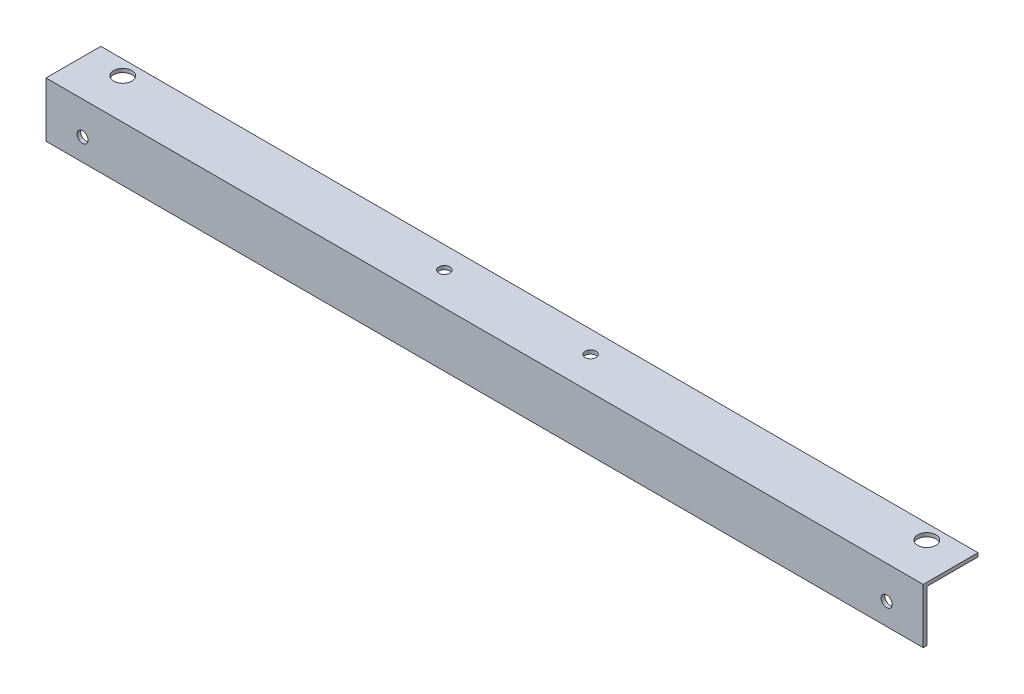
ISO-10303-21;
HEADER;
FILE_DESCRIPTION(('STEP AP214'),'2;1');
FILE_NAME('part.step','',(''),(''),'','','');
FILE_SCHEMA(('AUTOMOTIVE_DESIGN { 1 0 10303 214 1 1 1 1 }'));
ENDSEC;
DATA;
#1=APPLICATION_CONTEXT('core data for automotive mechanical design processes');
#2=APPLICATION_PROTOCOL_DEFINITION('international standard','automotive_design',2000,#1);
#3=PRODUCT_CONTEXT('',#1,'mechanical');
#4=PRODUCT('Part','Part','',(#3));
#5=PRODUCT_RELATED_PRODUCT_CATEGORY('part','',(#4));
#6=PRODUCT_DEFINITION_FORMATION('','',#4);
#7=PRODUCT_DEFINITION_CONTEXT('part definition',#1,'design');
#8=PRODUCT_DEFINITION('design','',#6,#7);
#9=PRODUCT_DEFINITION_SHAPE('','',#8);
#10=(LENGTH_UNIT() NAMED_UNIT(*) SI_UNIT(.MILLI.,.METRE.));
#11=(NAMED_UNIT(*) PLANE_ANGLE_UNIT() SI_UNIT($,.RADIAN.));
#12=(NAMED_UNIT(*) SI_UNIT($,.STERADIAN.) SOLID_ANGLE_UNIT());
#13=UNCERTAINTY_MEASURE_WITH_UNIT(LENGTH_MEASURE(1.E-05),#10,'distance_accuracy_value','');
#14=(GEOMETRIC_REPRESENTATION_CONTEXT(3) GLOBAL_UNCERTAINTY_ASSIGNED_CONTEXT((#13)) GLOBAL_UNIT_ASSIGNED_CONTEXT((#10,
#11,#12)) REPRESENTATION_CONTEXT('',''));
#15=CARTESIAN_POINT('',(0.,0.,0.));
#16=DIRECTION('',(0.,0.,1.));
#17=DIRECTION('',(1.,0.,0.));
#18=AXIS2_PLACEMENT_3D('',#15,#16,#17);
#19=CARTESIAN_POINT('',(120.,-1.,0.));
#20=DIRECTION('',(0.,1.,0.));
#21=DIRECTION('',(0.,0.,1.));
#22=AXIS2_PLACEMENT_3D('',#19,#20,#21);
#23=PLANE('',#22);
#24=CARTESIAN_POINT('',(-110.,-1.,-11.));
#25=DIRECTION('',(0.,1.,0.));
#26=DIRECTION('',(0.,0.,1.));
#27=AXIS2_PLACEMENT_3D('',#24,#25,#26);
#28=CIRCLE('',#27,2.50000000000001);
#29=CARTESIAN_POINT('',(-110.,-1.,-8.49999999999999));
#30=VERTEX_POINT('',#29);
#31=EDGE_CURVE('E144',#30,#30,#28,.T.);
#32=ORIENTED_EDGE('',*,*,#31,.T.);
#33=EDGE_LOOP('',(#32));
#34=FACE_BOUND('',#33,.T.);
#35=CARTESIAN_POINT('',(20.,-1.,-9.));
#36=DIRECTION('',(0.,1.,0.));
#37=DIRECTION('',(0.,0.,1.));
#38=AXIS2_PLACEMENT_3D('',#35,#36,#37);
#39=CIRCLE('',#38,1.5);
#40=CARTESIAN_POINT('',(20.,-1.,-7.5));
#41=VERTEX_POINT('',#40);
#42=EDGE_CURVE('E184',#41,#41,#39,.T.);
#43=ORIENTED_EDGE('',*,*,#42,.T.);
#44=EDGE_LOOP('',(#43));
#45=FACE_BOUND('',#44,.T.);
#46=CARTESIAN_POINT('',(110.,-1.,-11.));
#47=DIRECTION('',(0.,1.,0.));
#48=DIRECTION('',(0.,0.,1.));
#49=AXIS2_PLACEMENT_3D('',#46,#47,#48);
#50=CIRCLE('',#49,2.50000000000001);
#51=CARTESIAN_POINT('',(110.,-1.,-8.49999999999999));
#52=VERTEX_POINT('',#51);
#53=EDGE_CURVE('E188',#52,#52,#50,.T.);
#54=ORIENTED_EDGE('',*,*,#53,.T.);
#55=EDGE_LOOP('',(#54));
#56=FACE_BOUND('',#55,.T.);
#57=CARTESIAN_POINT('',(-20.,-1.,-9.));
#58=DIRECTION('',(0.,1.,0.));
#59=DIRECTION('',(0.,0.,1.));
#60=AXIS2_PLACEMENT_3D('',#57,#58,#59);
#61=CIRCLE('',#60,1.5);
#62=CARTESIAN_POINT('',(-20.,-1.,-7.5));
#63=VERTEX_POINT('',#62);
#64=EDGE_CURVE('E191',#63,#63,#61,.T.);
#65=ORIENTED_EDGE('',*,*,#64,.T.);
#66=EDGE_LOOP('',(#65));
#67=FACE_BOUND('',#66,.T.);
#68=DIRECTION('',(0.,0.,-1.));
#69=VECTOR('',#68,1.);
#70=CARTESIAN_POINT('',(-120.,-1.,0.));
#71=LINE('',#70,#69);
#72=CARTESIAN_POINT('',(-120.,-1.,-1.));
#73=VERTEX_POINT('',#72);
#74=CARTESIAN_POINT('',(-120.,-1.,-15.));
#75=VERTEX_POINT('',#74);
#76=EDGE_CURVE('E116',#73,#75,#71,.T.);
#77=ORIENTED_EDGE('',*,*,#76,.T.);
#78=DIRECTION('',(-1.,0.,0.));
#79=VECTOR('',#78,1.);
#80=CARTESIAN_POINT('',(120.,-1.,-15.));
#81=LINE('',#80,#79);
#82=CARTESIAN_POINT('',(120.,-1.,-15.));
#83=VERTEX_POINT('',#82);
#84=EDGE_CURVE('E11',#83,#75,#81,.T.);
#85=ORIENTED_EDGE('',*,*,#84,.F.);
#86=DIRECTION('',(0.,0.,-1.));
#87=VECTOR('',#86,1.);
#88=CARTESIAN_POINT('',(120.,-1.,0.));
#89=LINE('',#88,#87);
#90=CARTESIAN_POINT('',(120.,-1.,-1.));
#91=VERTEX_POINT('',#90);
#92=EDGE_CURVE('E81',#91,#83,#89,.T.);
#93=ORIENTED_EDGE('',*,*,#92,.F.);
#94=DIRECTION('',(-1.,0.,0.));
#95=VECTOR('',#94,1.);
#96=CARTESIAN_POINT('',(120.,-1.,-1.));
#97=LINE('',#96,#95);
#98=EDGE_CURVE('E112',#91,#73,#97,.T.);
#99=ORIENTED_EDGE('',*,*,#98,.T.);
#100=EDGE_LOOP('',(#77,#85,#93,#99));
#101=FACE_BOUND('',#100,.T.);
#102=ADVANCED_FACE('F33',(#34,#45,#56,#67,#101),#23,.F.);
#103=CARTESIAN_POINT('',(120.,0.,-15.));
#104=DIRECTION('',(0.,0.,-1.));
#105=DIRECTION('',(-1.,0.,0.));
#106=AXIS2_PLACEMENT_3D('',#103,#104,#105);
#107=PLANE('',#106);
#108=DIRECTION('',(0.,-1.,0.));
#109=VECTOR('',#108,1.);
#110=CARTESIAN_POINT('',(-120.,0.,-15.));
#111=LINE('',#110,#109);
#112=CARTESIAN_POINT('',(-120.,0.,-15.));
#113=VERTEX_POINT('',#112);
#114=EDGE_CURVE('E119',#113,#75,#111,.T.);
#115=ORIENTED_EDGE('',*,*,#114,.F.);
#116=DIRECTION('',(-1.,0.,0.));
#117=VECTOR('',#116,1.);
#118=CARTESIAN_POINT('',(120.,0.,-15.));
#119=LINE('',#118,#117);
#120=CARTESIAN_POINT('',(120.,0.,-15.));
#121=VERTEX_POINT('',#120);
#122=EDGE_CURVE('E42',#121,#113,#119,.T.);
#123=ORIENTED_EDGE('',*,*,#122,.F.);
#124=DIRECTION('',(0.,-1.,0.));
#125=VECTOR('',#124,1.);
#126=CARTESIAN_POINT('',(120.,0.,-15.));
#127=LINE('',#126,#125);
#128=EDGE_CURVE('E150',#121,#83,#127,.T.);
#129=ORIENTED_EDGE('',*,*,#128,.T.);
#130=ORIENTED_EDGE('',*,*,#84,.T.);
#131=EDGE_LOOP('',(#115,#123,#129,#130));
#132=FACE_BOUND('',#131,.T.);
#133=ADVANCED_FACE('F172',(#132),#107,.T.);
#134=CARTESIAN_POINT('',(120.,0.,0.));
#135=DIRECTION('',(0.,1.,0.));
#136=DIRECTION('',(0.,0.,1.));
#137=AXIS2_PLACEMENT_3D('',#134,#135,#136);
#138=PLANE('',#137);
#139=CARTESIAN_POINT('',(-110.,0.,-11.));
#140=DIRECTION('',(0.,1.,0.));
#141=DIRECTION('',(0.,0.,1.));
#142=AXIS2_PLACEMENT_3D('',#139,#140,#141);
#143=CIRCLE('',#142,2.50000000000001);
#144=CARTESIAN_POINT('',(-110.,0.,-8.49999999999999));
#145=VERTEX_POINT('',#144);
#146=EDGE_CURVE('E193',#145,#145,#143,.T.);
#147=ORIENTED_EDGE('',*,*,#146,.F.);
#148=EDGE_LOOP('',(#147));
#149=FACE_BOUND('',#148,.T.);
#150=CARTESIAN_POINT('',(20.,0.,-9.));
#151=DIRECTION('',(0.,1.,0.));
#152=DIRECTION('',(0.,0.,-1.));
#153=AXIS2_PLACEMENT_3D('',#150,#151,#152);
#154=CIRCLE('',#153,1.5);
#155=CARTESIAN_POINT('',(20.,0.,-10.5));
#156=VERTEX_POINT('',#155);
#157=EDGE_CURVE('E203',#156,#156,#154,.T.);
#158=ORIENTED_EDGE('',*,*,#157,.F.);
#159=EDGE_LOOP('',(#158));
#160=FACE_BOUND('',#159,.T.);
#161=CARTESIAN_POINT('',(110.,0.,-11.));
#162=DIRECTION('',(0.,1.,0.));
#163=DIRECTION('',(0.,0.,-1.));
#164=AXIS2_PLACEMENT_3D('',#161,#162,#163);
#165=CIRCLE('',#164,2.50000000000001);
#166=CARTESIAN_POINT('',(110.,0.,-13.5));
#167=VERTEX_POINT('',#166);
#168=EDGE_CURVE('E200',#167,#167,#165,.T.);
#169=ORIENTED_EDGE('',*,*,#168,.F.);
#170=EDGE_LOOP('',(#169));
#171=FACE_BOUND('',#170,.T.);
#172=CARTESIAN_POINT('',(-20.,0.,-9.));
#173=DIRECTION('',(0.,1.,0.));
#174=DIRECTION('',(0.,0.,1.));
#175=AXIS2_PLACEMENT_3D('',#172,#173,#174);
#176=CIRCLE('',#175,1.5);
#177=CARTESIAN_POINT('',(-20.,0.,-7.5));
#178=VERTEX_POINT('',#177);
#179=EDGE_CURVE('E197',#178,#178,#176,.T.);
#180=ORIENTED_EDGE('',*,*,#179,.F.);
#181=EDGE_LOOP('',(#180));
#182=FACE_BOUND('',#181,.T.);
#183=DIRECTION('',(0.,0.,-1.));
#184=VECTOR('',#183,1.);
#185=CARTESIAN_POINT('',(-120.,0.,0.));
#186=LINE('',#185,#184);
#187=CARTESIAN_POINT('',(-120.,0.,0.));
#188=VERTEX_POINT('',#187);
#189=EDGE_CURVE('E122',#188,#113,#186,.T.);
#190=ORIENTED_EDGE('',*,*,#189,.F.);
#191=DIRECTION('',(-1.,0.,0.));
#192=VECTOR('',#191,1.);
#193=CARTESIAN_POINT('',(120.,0.,0.));
#194=LINE('',#193,#192);
#195=CARTESIAN_POINT('',(120.,0.,0.));
#196=VERTEX_POINT('',#195);
#197=EDGE_CURVE('E102',#196,#188,#194,.T.);
#198=ORIENTED_EDGE('',*,*,#197,.F.);
#199=DIRECTION('',(0.,0.,-1.));
#200=VECTOR('',#199,1.);
#201=CARTESIAN_POINT('',(120.,0.,0.));
#202=LINE('',#201,#200);
#203=EDGE_CURVE('E108',#196,#121,#202,.T.);
#204=ORIENTED_EDGE('',*,*,#203,.T.);
#205=ORIENTED_EDGE('',*,*,#122,.T.);
#206=EDGE_LOOP('',(#190,#198,#204,#205));
#207=FACE_BOUND('',#206,.T.);
#208=ADVANCED_FACE('F154',(#149,#160,#171,#182,#207),#138,.T.);
#209=CARTESIAN_POINT('',(120.,-15.,0.));
#210=DIRECTION('',(0.,0.,1.));
#211=DIRECTION('',(1.,0.,0.));
#212=AXIS2_PLACEMENT_3D('',#209,#210,#211);
#213=PLANE('',#212);
#214=CARTESIAN_POINT('',(-110.,-9.,0.));
#215=DIRECTION('',(0.,0.,1.));
#216=DIRECTION('',(1.,0.,0.));
#217=AXIS2_PLACEMENT_3D('',#214,#215,#216);
#218=CIRCLE('',#217,1.5);
#219=CARTESIAN_POINT('',(-108.5,-9.,0.));
#220=VERTEX_POINT('',#219);
#221=EDGE_CURVE('E134',#220,#220,#218,.T.);
#222=ORIENTED_EDGE('',*,*,#221,.F.);
#223=EDGE_LOOP('',(#222));
#224=FACE_BOUND('',#223,.T.);
#225=CARTESIAN_POINT('',(110.,-9.,0.));
#226=DIRECTION('',(0.,0.,1.));
#227=DIRECTION('',(-1.,0.,0.));
#228=AXIS2_PLACEMENT_3D('',#225,#226,#227);
#229=CIRCLE('',#228,1.5);
#230=CARTESIAN_POINT('',(108.5,-9.,0.));
#231=VERTEX_POINT('',#230);
#232=EDGE_CURVE('E139',#231,#231,#229,.T.);
#233=ORIENTED_EDGE('',*,*,#232,.F.);
#234=EDGE_LOOP('',(#233));
#235=FACE_BOUND('',#234,.T.);
#236=DIRECTION('',(0.,1.,0.));
#237=VECTOR('',#236,1.);
#238=CARTESIAN_POINT('',(-120.,-15.,0.));
#239=LINE('',#238,#237);
#240=CARTESIAN_POINT('',(-120.,-15.,0.));
#241=VERTEX_POINT('',#240);
#242=EDGE_CURVE('E97',#241,#188,#239,.T.);
#243=ORIENTED_EDGE('',*,*,#242,.F.);
#244=DIRECTION('',(-1.,0.,0.));
#245=VECTOR('',#244,1.);
#246=CARTESIAN_POINT('',(120.,-15.,0.));
#247=LINE('',#246,#245);
#248=CARTESIAN_POINT('',(120.,-15.,0.));
#249=VERTEX_POINT('',#248);
#250=EDGE_CURVE('E92',#249,#241,#247,.T.);
#251=ORIENTED_EDGE('',*,*,#250,.F.);
#252=DIRECTION('',(0.,1.,0.));
#253=VECTOR('',#252,1.);
#254=CARTESIAN_POINT('',(120.,-15.,0.));
#255=LINE('',#254,#253);
#256=EDGE_CURVE('E95',#249,#196,#255,.T.);
#257=ORIENTED_EDGE('',*,*,#256,.T.);
#258=ORIENTED_EDGE('',*,*,#197,.T.);
#259=EDGE_LOOP('',(#243,#251,#257,#258));
#260=FACE_BOUND('',#259,.T.);
#261=ADVANCED_FACE('F94',(#224,#235,#260),#213,.T.);
#262=CARTESIAN_POINT('',(120.,-15.,-1.));
#263=DIRECTION('',(0.,-1.,0.));
#264=DIRECTION('',(0.,0.,-1.));
#265=AXIS2_PLACEMENT_3D('',#262,#263,#264);
#266=PLANE('',#265);
#267=DIRECTION('',(0.,0.,1.));
#268=VECTOR('',#267,1.);
#269=CARTESIAN_POINT('',(-120.,-15.,-1.));
#270=LINE('',#269,#268);
#271=CARTESIAN_POINT('',(-120.,-15.,-1.));
#272=VERTEX_POINT('',#271);
#273=EDGE_CURVE('E126',#272,#241,#270,.T.);
#274=ORIENTED_EDGE('',*,*,#273,.F.);
#275=DIRECTION('',(-1.,0.,0.));
#276=VECTOR('',#275,1.);
#277=CARTESIAN_POINT('',(120.,-15.,-1.));
#278=LINE('',#277,#276);
#279=CARTESIAN_POINT('',(120.,-15.,-1.));
#280=VERTEX_POINT('',#279);
#281=EDGE_CURVE('E72',#280,#272,#278,.T.);
#282=ORIENTED_EDGE('',*,*,#281,.F.);
#283=DIRECTION('',(0.,0.,1.));
#284=VECTOR('',#283,1.);
#285=CARTESIAN_POINT('',(120.,-15.,-1.));
#286=LINE('',#285,#284);
#287=EDGE_CURVE('E106',#280,#249,#286,.T.);
#288=ORIENTED_EDGE('',*,*,#287,.T.);
#289=ORIENTED_EDGE('',*,*,#250,.T.);
#290=EDGE_LOOP('',(#274,#282,#288,#289));
#291=FACE_BOUND('',#290,.T.);
#292=ADVANCED_FACE('F110',(#291),#266,.T.);
#293=CARTESIAN_POINT('',(120.,-15.,-1.));
#294=DIRECTION('',(0.,0.,1.));
#295=DIRECTION('',(1.,0.,0.));
#296=AXIS2_PLACEMENT_3D('',#293,#294,#295);
#297=PLANE('',#296);
#298=CARTESIAN_POINT('',(-110.,-9.,-1.));
#299=DIRECTION('',(0.,0.,1.));
#300=DIRECTION('',(1.,0.,0.));
#301=AXIS2_PLACEMENT_3D('',#298,#299,#300);
#302=CIRCLE('',#301,1.5);
#303=CARTESIAN_POINT('',(-108.5,-9.,-1.));
#304=VERTEX_POINT('',#303);
#305=EDGE_CURVE('E36',#304,#304,#302,.T.);
#306=ORIENTED_EDGE('',*,*,#305,.T.);
#307=EDGE_LOOP('',(#306));
#308=FACE_BOUND('',#307,.T.);
#309=CARTESIAN_POINT('',(110.,-9.,-1.));
#310=DIRECTION('',(0.,0.,1.));
#311=DIRECTION('',(1.,0.,0.));
#312=AXIS2_PLACEMENT_3D('',#309,#310,#311);
#313=CIRCLE('',#312,1.5);
#314=CARTESIAN_POINT('',(111.5,-9.,-1.));
#315=VERTEX_POINT('',#314);
#316=EDGE_CURVE('E132',#315,#315,#313,.T.);
#317=ORIENTED_EDGE('',*,*,#316,.T.);
#318=EDGE_LOOP('',(#317));
#319=FACE_BOUND('',#318,.T.);
#320=DIRECTION('',(0.,1.,0.));
#321=VECTOR('',#320,1.);
#322=CARTESIAN_POINT('',(-120.,-15.,-1.));
#323=LINE('',#322,#321);
#324=EDGE_CURVE('E75',#272,#73,#323,.T.);
#325=ORIENTED_EDGE('',*,*,#324,.T.);
#326=ORIENTED_EDGE('',*,*,#98,.F.);
#327=DIRECTION('',(0.,1.,0.));
#328=VECTOR('',#327,1.);
#329=CARTESIAN_POINT('',(120.,-15.,-1.));
#330=LINE('',#329,#328);
#331=EDGE_CURVE('E51',#280,#91,#330,.T.);
#332=ORIENTED_EDGE('',*,*,#331,.F.);
#333=ORIENTED_EDGE('',*,*,#281,.T.);
#334=EDGE_LOOP('',(#325,#326,#332,#333));
#335=FACE_BOUND('',#334,.T.);
#336=ADVANCED_FACE('F160',(#308,#319,#335),#297,.F.);
#337=CARTESIAN_POINT('',(120.,0.,0.));
#338=DIRECTION('',(-1.,0.,0.));
#339=DIRECTION('',(0.,0.,1.));
#340=AXIS2_PLACEMENT_3D('',#337,#338,#339);
#341=PLANE('',#340);
#342=ORIENTED_EDGE('',*,*,#92,.T.);
#343=ORIENTED_EDGE('',*,*,#128,.F.);
#344=ORIENTED_EDGE('',*,*,#203,.F.);
#345=ORIENTED_EDGE('',*,*,#256,.F.);
#346=ORIENTED_EDGE('',*,*,#287,.F.);
#347=ORIENTED_EDGE('',*,*,#331,.T.);
#348=EDGE_LOOP('',(#342,#343,#344,#345,#346,#347));
#349=FACE_BOUND('',#348,.T.);
#350=ADVANCED_FACE('F105',(#349),#341,.F.);
#351=CARTESIAN_POINT('',(-120.,0.,0.));
#352=DIRECTION('',(-1.,0.,0.));
#353=DIRECTION('',(0.,0.,1.));
#354=AXIS2_PLACEMENT_3D('',#351,#352,#353);
#355=PLANE('',#354);
#356=ORIENTED_EDGE('',*,*,#76,.F.);
#357=ORIENTED_EDGE('',*,*,#324,.F.);
#358=ORIENTED_EDGE('',*,*,#273,.T.);
#359=ORIENTED_EDGE('',*,*,#242,.T.);
#360=ORIENTED_EDGE('',*,*,#189,.T.);
#361=ORIENTED_EDGE('',*,*,#114,.T.);
#362=EDGE_LOOP('',(#356,#357,#358,#359,#360,#361));
#363=FACE_BOUND('',#362,.T.);
#364=ADVANCED_FACE('F158',(#363),#355,.T.);
#365=CARTESIAN_POINT('',(110.,-9.,-3.));
#366=DIRECTION('',(0.,0.,1.));
#367=DIRECTION('',(1.,0.,0.));
#368=AXIS2_PLACEMENT_3D('',#365,#366,#367);
#369=CYLINDRICAL_SURFACE('',#368,1.5);
#370=ORIENTED_EDGE('',*,*,#232,.T.);
#371=EDGE_LOOP('',(#370));
#372=FACE_BOUND('',#371,.T.);
#373=ORIENTED_EDGE('',*,*,#316,.F.);
#374=EDGE_LOOP('',(#373));
#375=FACE_BOUND('',#374,.T.);
#376=ADVANCED_FACE('F231',(#372,#375),#369,.F.);
#377=CARTESIAN_POINT('',(-110.,-9.,-3.));
#378=DIRECTION('',(0.,0.,1.));
#379=DIRECTION('',(1.,0.,0.));
#380=AXIS2_PLACEMENT_3D('',#377,#378,#379);
#381=CYLINDRICAL_SURFACE('',#380,1.5);
#382=ORIENTED_EDGE('',*,*,#221,.T.);
#383=EDGE_LOOP('',(#382));
#384=FACE_BOUND('',#383,.T.);
#385=ORIENTED_EDGE('',*,*,#305,.F.);
#386=EDGE_LOOP('',(#385));
#387=FACE_BOUND('',#386,.T.);
#388=ADVANCED_FACE('F223',(#384,#387),#381,.F.);
#389=CARTESIAN_POINT('',(-20.,-3.,-9.));
#390=DIRECTION('',(0.,1.,0.));
#391=DIRECTION('',(0.,0.,1.));
#392=AXIS2_PLACEMENT_3D('',#389,#390,#391);
#393=CYLINDRICAL_SURFACE('',#392,1.5);
#394=ORIENTED_EDGE('',*,*,#179,.T.);
#395=EDGE_LOOP('',(#394));
#396=FACE_BOUND('',#395,.T.);
#397=ORIENTED_EDGE('',*,*,#64,.F.);
#398=EDGE_LOOP('',(#397));
#399=FACE_BOUND('',#398,.T.);
#400=ADVANCED_FACE('F220',(#396,#399),#393,.F.);
#401=CARTESIAN_POINT('',(110.,-3.,-11.));
#402=DIRECTION('',(0.,1.,0.));
#403=DIRECTION('',(0.,0.,1.));
#404=AXIS2_PLACEMENT_3D('',#401,#402,#403);
#405=CYLINDRICAL_SURFACE('',#404,2.50000000000001);
#406=ORIENTED_EDGE('',*,*,#168,.T.);
#407=EDGE_LOOP('',(#406));
#408=FACE_BOUND('',#407,.T.);
#409=ORIENTED_EDGE('',*,*,#53,.F.);
#410=EDGE_LOOP('',(#409));
#411=FACE_BOUND('',#410,.T.);
#412=ADVANCED_FACE('F222',(#408,#411),#405,.F.);
#413=CARTESIAN_POINT('',(20.,-3.,-9.));
#414=DIRECTION('',(0.,1.,0.));
#415=DIRECTION('',(0.,0.,1.));
#416=AXIS2_PLACEMENT_3D('',#413,#414,#415);
#417=CYLINDRICAL_SURFACE('',#416,1.5);
#418=ORIENTED_EDGE('',*,*,#157,.T.);
#419=EDGE_LOOP('',(#418));
#420=FACE_BOUND('',#419,.T.);
#421=ORIENTED_EDGE('',*,*,#42,.F.);
#422=EDGE_LOOP('',(#421));
#423=FACE_BOUND('',#422,.T.);
#424=ADVANCED_FACE('F209',(#420,#423),#417,.F.);
#425=CARTESIAN_POINT('',(-110.,-3.,-11.));
#426=DIRECTION('',(0.,1.,0.));
#427=DIRECTION('',(0.,0.,1.));
#428=AXIS2_PLACEMENT_3D('',#425,#426,#427);
#429=CYLINDRICAL_SURFACE('',#428,2.50000000000001);
#430=ORIENTED_EDGE('',*,*,#146,.T.);
#431=EDGE_LOOP('',(#430));
#432=FACE_BOUND('',#431,.T.);
#433=ORIENTED_EDGE('',*,*,#31,.F.);
#434=EDGE_LOOP('',(#433));
#435=FACE_BOUND('',#434,.T.);
#436=ADVANCED_FACE('F284',(#432,#435),#429,.F.);
#437=CLOSED_SHELL('',(#102,#133,#208,#261,#292,#336,#350,#364,#376,#388,#400,#412,#424,#436));
#438=MANIFOLD_SOLID_BREP('B2',#437);
#439=ADVANCED_BREP_SHAPE_REPRESENTATION('',(#18,#438),#14);
#440=SHAPE_DEFINITION_REPRESENTATION(#9,#439);
ENDSEC;
END-ISO-10303-21;
